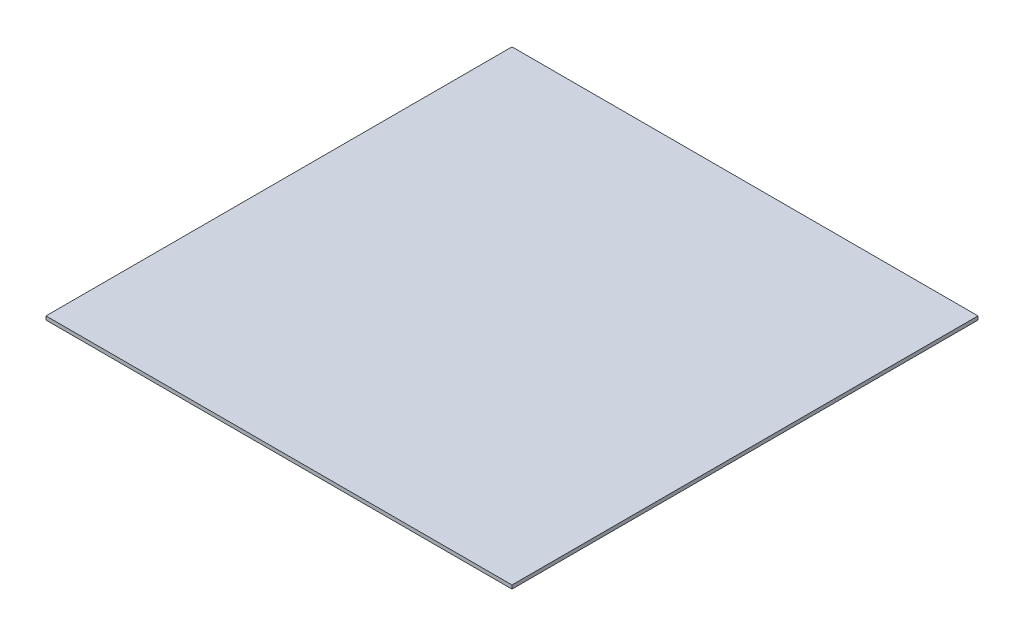
ISO-10303-21;
HEADER;
FILE_DESCRIPTION(('STEP AP214'),'2;1');
FILE_NAME('part.step','',(''),(''),'','','');
FILE_SCHEMA(('AUTOMOTIVE_DESIGN { 1 0 10303 214 1 1 1 1 }'));
ENDSEC;
DATA;
#1=APPLICATION_CONTEXT('core data for automotive mechanical design processes');
#2=APPLICATION_PROTOCOL_DEFINITION('international standard','automotive_design',2000,#1);
#3=PRODUCT_CONTEXT('',#1,'mechanical');
#4=PRODUCT('Part','Part','',(#3));
#5=PRODUCT_RELATED_PRODUCT_CATEGORY('part','',(#4));
#6=PRODUCT_DEFINITION_FORMATION('','',#4);
#7=PRODUCT_DEFINITION_CONTEXT('part definition',#1,'design');
#8=PRODUCT_DEFINITION('design','',#6,#7);
#9=PRODUCT_DEFINITION_SHAPE('','',#8);
#10=(LENGTH_UNIT() NAMED_UNIT(*) SI_UNIT(.MILLI.,.METRE.));
#11=(NAMED_UNIT(*) PLANE_ANGLE_UNIT() SI_UNIT($,.RADIAN.));
#12=(NAMED_UNIT(*) SI_UNIT($,.STERADIAN.) SOLID_ANGLE_UNIT());
#13=UNCERTAINTY_MEASURE_WITH_UNIT(LENGTH_MEASURE(1.E-05),#10,'distance_accuracy_value','');
#14=(GEOMETRIC_REPRESENTATION_CONTEXT(3) GLOBAL_UNCERTAINTY_ASSIGNED_CONTEXT((#13)) GLOBAL_UNIT_ASSIGNED_CONTEXT((#10,
#11,#12)) REPRESENTATION_CONTEXT('',''));
#15=CARTESIAN_POINT('',(0.,0.,0.));
#16=DIRECTION('',(0.,0.,1.));
#17=DIRECTION('',(1.,0.,0.));
#18=AXIS2_PLACEMENT_3D('',#15,#16,#17);
#19=CARTESIAN_POINT('',(-101.6,1.5875,-101.6));
#20=DIRECTION('',(1.,0.,0.));
#21=DIRECTION('',(0.,0.,-1.));
#22=AXIS2_PLACEMENT_3D('',#19,#20,#21);
#23=PLANE('',#22);
#24=DIRECTION('',(0.,0.,1.));
#25=VECTOR('',#24,1.);
#26=CARTESIAN_POINT('',(-101.6,0.,-101.6));
#27=LINE('',#26,#25);
#28=CARTESIAN_POINT('',(-101.6,0.,-101.6));
#29=VERTEX_POINT('',#28);
#30=CARTESIAN_POINT('',(-101.6,0.,101.6));
#31=VERTEX_POINT('',#30);
#32=EDGE_CURVE('E96',#29,#31,#27,.T.);
#33=ORIENTED_EDGE('',*,*,#32,.T.);
#34=DIRECTION('',(0.,-1.,0.));
#35=VECTOR('',#34,1.);
#36=CARTESIAN_POINT('',(-101.6,1.5875,101.6));
#37=LINE('',#36,#35);
#38=CARTESIAN_POINT('',(-101.6,1.5875,101.6));
#39=VERTEX_POINT('',#38);
#40=EDGE_CURVE('E11',#39,#31,#37,.T.);
#41=ORIENTED_EDGE('',*,*,#40,.F.);
#42=DIRECTION('',(0.,0.,1.));
#43=VECTOR('',#42,1.);
#44=CARTESIAN_POINT('',(-101.6,1.5875,-101.6));
#45=LINE('',#44,#43);
#46=CARTESIAN_POINT('',(-101.6,1.5875,-101.6));
#47=VERTEX_POINT('',#46);
#48=EDGE_CURVE('E84',#47,#39,#45,.T.);
#49=ORIENTED_EDGE('',*,*,#48,.F.);
#50=DIRECTION('',(0.,-1.,0.));
#51=VECTOR('',#50,1.);
#52=CARTESIAN_POINT('',(-101.6,1.5875,-101.6));
#53=LINE('',#52,#51);
#54=EDGE_CURVE('E92',#47,#29,#53,.T.);
#55=ORIENTED_EDGE('',*,*,#54,.T.);
#56=EDGE_LOOP('',(#33,#41,#49,#55));
#57=FACE_BOUND('',#56,.T.);
#58=ADVANCED_FACE('F33',(#57),#23,.F.);
#59=CARTESIAN_POINT('',(-101.6,1.5875,101.6));
#60=DIRECTION('',(0.,0.,-1.));
#61=DIRECTION('',(-1.,0.,0.));
#62=AXIS2_PLACEMENT_3D('',#59,#60,#61);
#63=PLANE('',#62);
#64=DIRECTION('',(1.,0.,0.));
#65=VECTOR('',#64,1.);
#66=CARTESIAN_POINT('',(-101.6,0.,101.6));
#67=LINE('',#66,#65);
#68=CARTESIAN_POINT('',(101.6,0.,101.6));
#69=VERTEX_POINT('',#68);
#70=EDGE_CURVE('E88',#31,#69,#67,.T.);
#71=ORIENTED_EDGE('',*,*,#70,.T.);
#72=DIRECTION('',(0.,-1.,0.));
#73=VECTOR('',#72,1.);
#74=CARTESIAN_POINT('',(101.6,1.5875,101.6));
#75=LINE('',#74,#73);
#76=CARTESIAN_POINT('',(101.6,1.5875,101.6));
#77=VERTEX_POINT('',#76);
#78=EDGE_CURVE('E41',#77,#69,#75,.T.);
#79=ORIENTED_EDGE('',*,*,#78,.F.);
#80=DIRECTION('',(1.,0.,0.));
#81=VECTOR('',#80,1.);
#82=CARTESIAN_POINT('',(-101.6,1.5875,101.6));
#83=LINE('',#82,#81);
#84=EDGE_CURVE('E79',#39,#77,#83,.T.);
#85=ORIENTED_EDGE('',*,*,#84,.F.);
#86=ORIENTED_EDGE('',*,*,#40,.T.);
#87=EDGE_LOOP('',(#71,#79,#85,#86));
#88=FACE_BOUND('',#87,.T.);
#89=ADVANCED_FACE('F87',(#88),#63,.F.);
#90=CARTESIAN_POINT('',(101.6,1.5875,-101.6));
#91=DIRECTION('',(-1.,0.,0.));
#92=DIRECTION('',(0.,0.,1.));
#93=AXIS2_PLACEMENT_3D('',#90,#91,#92);
#94=PLANE('',#93);
#95=DIRECTION('',(0.,0.,-1.));
#96=VECTOR('',#95,1.);
#97=CARTESIAN_POINT('',(101.6,0.,-101.6));
#98=LINE('',#97,#96);
#99=CARTESIAN_POINT('',(101.6,0.,-101.6));
#100=VERTEX_POINT('',#99);
#101=EDGE_CURVE('E66',#69,#100,#98,.T.);
#102=ORIENTED_EDGE('',*,*,#101,.T.);
#103=DIRECTION('',(0.,-1.,0.));
#104=VECTOR('',#103,1.);
#105=CARTESIAN_POINT('',(101.6,1.5875,-101.6));
#106=LINE('',#105,#104);
#107=CARTESIAN_POINT('',(101.6,1.5875,-101.6));
#108=VERTEX_POINT('',#107);
#109=EDGE_CURVE('E89',#108,#100,#106,.T.);
#110=ORIENTED_EDGE('',*,*,#109,.F.);
#111=DIRECTION('',(0.,0.,-1.));
#112=VECTOR('',#111,1.);
#113=CARTESIAN_POINT('',(101.6,1.5875,-101.6));
#114=LINE('',#113,#112);
#115=EDGE_CURVE('E82',#77,#108,#114,.T.);
#116=ORIENTED_EDGE('',*,*,#115,.F.);
#117=ORIENTED_EDGE('',*,*,#78,.T.);
#118=EDGE_LOOP('',(#102,#110,#116,#117));
#119=FACE_BOUND('',#118,.T.);
#120=ADVANCED_FACE('F90',(#119),#94,.F.);
#121=CARTESIAN_POINT('',(-101.6,1.5875,-101.6));
#122=DIRECTION('',(0.,0.,1.));
#123=DIRECTION('',(1.,0.,0.));
#124=AXIS2_PLACEMENT_3D('',#121,#122,#123);
#125=PLANE('',#124);
#126=DIRECTION('',(-1.,0.,0.));
#127=VECTOR('',#126,1.);
#128=CARTESIAN_POINT('',(-101.6,0.,-101.6));
#129=LINE('',#128,#127);
#130=EDGE_CURVE('E72',#100,#29,#129,.T.);
#131=ORIENTED_EDGE('',*,*,#130,.T.);
#132=ORIENTED_EDGE('',*,*,#54,.F.);
#133=DIRECTION('',(-1.,0.,0.));
#134=VECTOR('',#133,1.);
#135=CARTESIAN_POINT('',(-101.6,1.5875,-101.6));
#136=LINE('',#135,#134);
#137=EDGE_CURVE('E49',#108,#47,#136,.T.);
#138=ORIENTED_EDGE('',*,*,#137,.F.);
#139=ORIENTED_EDGE('',*,*,#109,.T.);
#140=EDGE_LOOP('',(#131,#132,#138,#139));
#141=FACE_BOUND('',#140,.T.);
#142=ADVANCED_FACE('F103',(#141),#125,.F.);
#143=CARTESIAN_POINT('',(-101.6,1.5875,101.6));
#144=DIRECTION('',(0.,1.,0.));
#145=DIRECTION('',(0.,0.,1.));
#146=AXIS2_PLACEMENT_3D('',#143,#144,#145);
#147=PLANE('',#146);
#148=ORIENTED_EDGE('',*,*,#48,.T.);
#149=ORIENTED_EDGE('',*,*,#84,.T.);
#150=ORIENTED_EDGE('',*,*,#115,.T.);
#151=ORIENTED_EDGE('',*,*,#137,.T.);
#152=EDGE_LOOP('',(#148,#149,#150,#151));
#153=FACE_BOUND('',#152,.T.);
#154=ADVANCED_FACE('F80',(#153),#147,.T.);
#155=CARTESIAN_POINT('',(-101.6,0.,101.6));
#156=DIRECTION('',(0.,1.,0.));
#157=DIRECTION('',(0.,0.,1.));
#158=AXIS2_PLACEMENT_3D('',#155,#156,#157);
#159=PLANE('',#158);
#160=ORIENTED_EDGE('',*,*,#32,.F.);
#161=ORIENTED_EDGE('',*,*,#130,.F.);
#162=ORIENTED_EDGE('',*,*,#101,.F.);
#163=ORIENTED_EDGE('',*,*,#70,.F.);
#164=EDGE_LOOP('',(#160,#161,#162,#163));
#165=FACE_BOUND('',#164,.T.);
#166=ADVANCED_FACE('F106',(#165),#159,.F.);
#167=CLOSED_SHELL('',(#58,#89,#120,#142,#154,#166));
#168=MANIFOLD_SOLID_BREP('B2',#167);
#169=ADVANCED_BREP_SHAPE_REPRESENTATION('',(#18,#168),#14);
#170=SHAPE_DEFINITION_REPRESENTATION(#9,#169);
ENDSEC;
END-ISO-10303-21;
